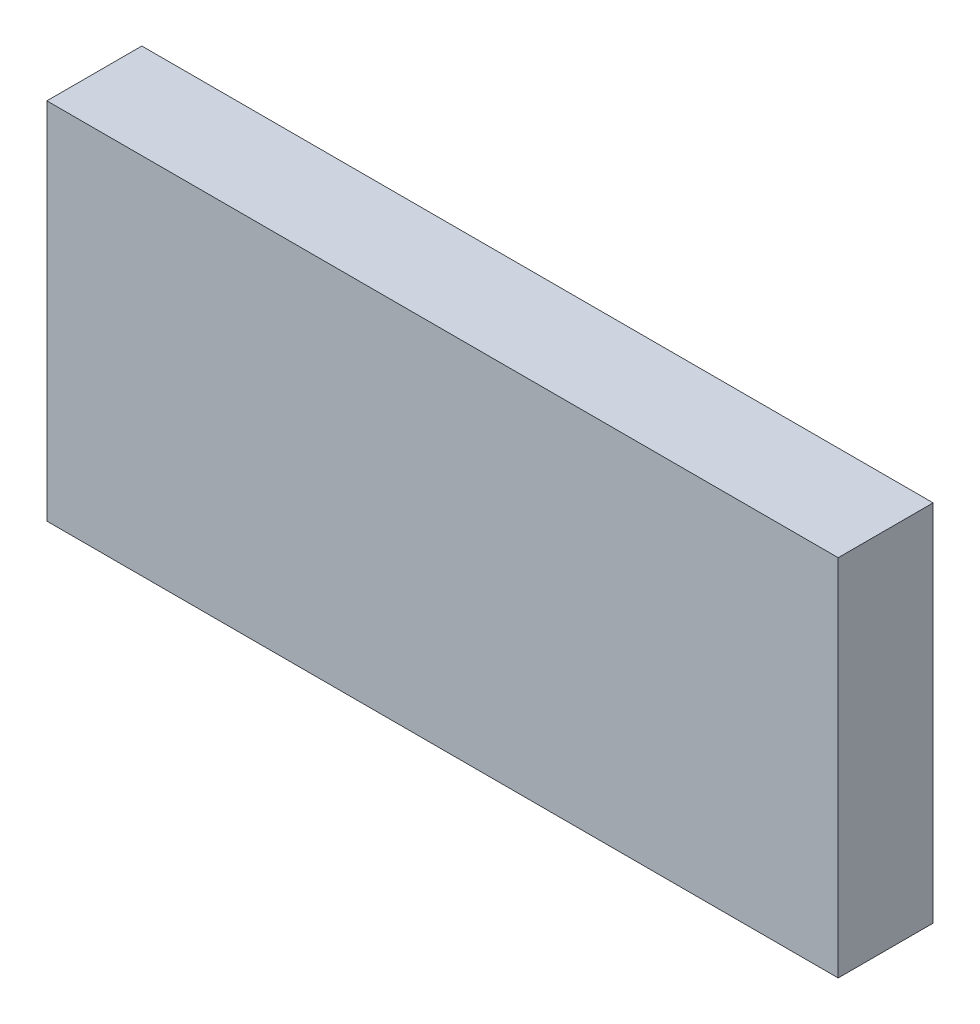
ISO-10303-21;
HEADER;
FILE_DESCRIPTION(('STEP AP214'),'2;1');
FILE_NAME('part.step','',(''),(''),'','','');
FILE_SCHEMA(('AUTOMOTIVE_DESIGN { 1 0 10303 214 1 1 1 1 }'));
ENDSEC;
DATA;
#1=APPLICATION_CONTEXT('core data for automotive mechanical design processes');
#2=APPLICATION_PROTOCOL_DEFINITION('international standard','automotive_design',2000,#1);
#3=PRODUCT_CONTEXT('',#1,'mechanical');
#4=PRODUCT('Part','Part','',(#3));
#5=PRODUCT_RELATED_PRODUCT_CATEGORY('part','',(#4));
#6=PRODUCT_DEFINITION_FORMATION('','',#4);
#7=PRODUCT_DEFINITION_CONTEXT('part definition',#1,'design');
#8=PRODUCT_DEFINITION('design','',#6,#7);
#9=PRODUCT_DEFINITION_SHAPE('','',#8);
#10=(LENGTH_UNIT() NAMED_UNIT(*) SI_UNIT(.MILLI.,.METRE.));
#11=(NAMED_UNIT(*) PLANE_ANGLE_UNIT() SI_UNIT($,.RADIAN.));
#12=(NAMED_UNIT(*) SI_UNIT($,.STERADIAN.) SOLID_ANGLE_UNIT());
#13=UNCERTAINTY_MEASURE_WITH_UNIT(LENGTH_MEASURE(1.E-05),#10,'distance_accuracy_value','');
#14=(GEOMETRIC_REPRESENTATION_CONTEXT(3) GLOBAL_UNCERTAINTY_ASSIGNED_CONTEXT((#13)) GLOBAL_UNIT_ASSIGNED_CONTEXT((#10,
#11,#12)) REPRESENTATION_CONTEXT('',''));
#15=CARTESIAN_POINT('',(0.,0.,0.));
#16=DIRECTION('',(0.,0.,1.));
#17=DIRECTION('',(1.,0.,0.));
#18=AXIS2_PLACEMENT_3D('',#15,#16,#17);
#19=CARTESIAN_POINT('',(0.,0.,6.));
#20=DIRECTION('',(-1.,0.,0.));
#21=DIRECTION('',(0.,-1.,0.));
#22=AXIS2_PLACEMENT_3D('',#19,#20,#21);
#23=PLANE('',#22);
#24=DIRECTION('',(0.,1.,0.));
#25=VECTOR('',#24,1.);
#26=CARTESIAN_POINT('',(0.,0.,0.));
#27=LINE('',#26,#25);
#28=CARTESIAN_POINT('',(0.,0.,0.));
#29=VERTEX_POINT('',#28);
#30=CARTESIAN_POINT('',(0.,23.,0.));
#31=VERTEX_POINT('',#30);
#32=EDGE_CURVE('E96',#29,#31,#27,.T.);
#33=ORIENTED_EDGE('',*,*,#32,.T.);
#34=DIRECTION('',(0.,0.,-1.));
#35=VECTOR('',#34,1.);
#36=CARTESIAN_POINT('',(0.,23.,6.));
#37=LINE('',#36,#35);
#38=CARTESIAN_POINT('',(0.,23.,6.));
#39=VERTEX_POINT('',#38);
#40=EDGE_CURVE('E11',#39,#31,#37,.T.);
#41=ORIENTED_EDGE('',*,*,#40,.F.);
#42=DIRECTION('',(0.,1.,0.));
#43=VECTOR('',#42,1.);
#44=CARTESIAN_POINT('',(0.,0.,6.));
#45=LINE('',#44,#43);
#46=CARTESIAN_POINT('',(0.,0.,6.));
#47=VERTEX_POINT('',#46);
#48=EDGE_CURVE('E84',#47,#39,#45,.T.);
#49=ORIENTED_EDGE('',*,*,#48,.F.);
#50=DIRECTION('',(0.,0.,-1.));
#51=VECTOR('',#50,1.);
#52=CARTESIAN_POINT('',(0.,0.,6.));
#53=LINE('',#52,#51);
#54=EDGE_CURVE('E92',#47,#29,#53,.T.);
#55=ORIENTED_EDGE('',*,*,#54,.T.);
#56=EDGE_LOOP('',(#33,#41,#49,#55));
#57=FACE_BOUND('',#56,.T.);
#58=ADVANCED_FACE('F33',(#57),#23,.F.);
#59=CARTESIAN_POINT('',(0.,23.,6.));
#60=DIRECTION('',(0.,-1.,0.));
#61=DIRECTION('',(1.,0.,0.));
#62=AXIS2_PLACEMENT_3D('',#59,#60,#61);
#63=PLANE('',#62);
#64=DIRECTION('',(-1.,0.,0.));
#65=VECTOR('',#64,1.);
#66=CARTESIAN_POINT('',(0.,23.,0.));
#67=LINE('',#66,#65);
#68=CARTESIAN_POINT('',(-50.,23.,0.));
#69=VERTEX_POINT('',#68);
#70=EDGE_CURVE('E88',#31,#69,#67,.T.);
#71=ORIENTED_EDGE('',*,*,#70,.T.);
#72=DIRECTION('',(0.,0.,-1.));
#73=VECTOR('',#72,1.);
#74=CARTESIAN_POINT('',(-50.,23.,6.));
#75=LINE('',#74,#73);
#76=CARTESIAN_POINT('',(-50.,23.,6.));
#77=VERTEX_POINT('',#76);
#78=EDGE_CURVE('E41',#77,#69,#75,.T.);
#79=ORIENTED_EDGE('',*,*,#78,.F.);
#80=DIRECTION('',(-1.,0.,0.));
#81=VECTOR('',#80,1.);
#82=CARTESIAN_POINT('',(0.,23.,6.));
#83=LINE('',#82,#81);
#84=EDGE_CURVE('E79',#39,#77,#83,.T.);
#85=ORIENTED_EDGE('',*,*,#84,.F.);
#86=ORIENTED_EDGE('',*,*,#40,.T.);
#87=EDGE_LOOP('',(#71,#79,#85,#86));
#88=FACE_BOUND('',#87,.T.);
#89=ADVANCED_FACE('F87',(#88),#63,.F.);
#90=CARTESIAN_POINT('',(-50.,0.,6.));
#91=DIRECTION('',(1.,0.,0.));
#92=DIRECTION('',(0.,0.,-1.));
#93=AXIS2_PLACEMENT_3D('',#90,#91,#92);
#94=PLANE('',#93);
#95=DIRECTION('',(0.,-1.,0.));
#96=VECTOR('',#95,1.);
#97=CARTESIAN_POINT('',(-50.,0.,0.));
#98=LINE('',#97,#96);
#99=CARTESIAN_POINT('',(-50.,0.,0.));
#100=VERTEX_POINT('',#99);
#101=EDGE_CURVE('E66',#69,#100,#98,.T.);
#102=ORIENTED_EDGE('',*,*,#101,.T.);
#103=DIRECTION('',(0.,0.,-1.));
#104=VECTOR('',#103,1.);
#105=CARTESIAN_POINT('',(-50.,0.,6.));
#106=LINE('',#105,#104);
#107=CARTESIAN_POINT('',(-50.,0.,6.));
#108=VERTEX_POINT('',#107);
#109=EDGE_CURVE('E89',#108,#100,#106,.T.);
#110=ORIENTED_EDGE('',*,*,#109,.F.);
#111=DIRECTION('',(0.,-1.,0.));
#112=VECTOR('',#111,1.);
#113=CARTESIAN_POINT('',(-50.,0.,6.));
#114=LINE('',#113,#112);
#115=EDGE_CURVE('E82',#77,#108,#114,.T.);
#116=ORIENTED_EDGE('',*,*,#115,.F.);
#117=ORIENTED_EDGE('',*,*,#78,.T.);
#118=EDGE_LOOP('',(#102,#110,#116,#117));
#119=FACE_BOUND('',#118,.T.);
#120=ADVANCED_FACE('F90',(#119),#94,.F.);
#121=CARTESIAN_POINT('',(0.,0.,6.));
#122=DIRECTION('',(0.,1.,0.));
#123=DIRECTION('',(-1.,0.,0.));
#124=AXIS2_PLACEMENT_3D('',#121,#122,#123);
#125=PLANE('',#124);
#126=DIRECTION('',(1.,0.,0.));
#127=VECTOR('',#126,1.);
#128=CARTESIAN_POINT('',(0.,0.,0.));
#129=LINE('',#128,#127);
#130=EDGE_CURVE('E72',#100,#29,#129,.T.);
#131=ORIENTED_EDGE('',*,*,#130,.T.);
#132=ORIENTED_EDGE('',*,*,#54,.F.);
#133=DIRECTION('',(1.,0.,0.));
#134=VECTOR('',#133,1.);
#135=CARTESIAN_POINT('',(0.,0.,6.));
#136=LINE('',#135,#134);
#137=EDGE_CURVE('E49',#108,#47,#136,.T.);
#138=ORIENTED_EDGE('',*,*,#137,.F.);
#139=ORIENTED_EDGE('',*,*,#109,.T.);
#140=EDGE_LOOP('',(#131,#132,#138,#139));
#141=FACE_BOUND('',#140,.T.);
#142=ADVANCED_FACE('F103',(#141),#125,.F.);
#143=CARTESIAN_POINT('',(0.,0.,6.));
#144=DIRECTION('',(0.,0.,1.));
#145=DIRECTION('',(1.,0.,0.));
#146=AXIS2_PLACEMENT_3D('',#143,#144,#145);
#147=PLANE('',#146);
#148=ORIENTED_EDGE('',*,*,#48,.T.);
#149=ORIENTED_EDGE('',*,*,#84,.T.);
#150=ORIENTED_EDGE('',*,*,#115,.T.);
#151=ORIENTED_EDGE('',*,*,#137,.T.);
#152=EDGE_LOOP('',(#148,#149,#150,#151));
#153=FACE_BOUND('',#152,.T.);
#154=ADVANCED_FACE('F80',(#153),#147,.T.);
#155=CARTESIAN_POINT('',(0.,0.,0.));
#156=DIRECTION('',(0.,0.,1.));
#157=DIRECTION('',(1.,0.,0.));
#158=AXIS2_PLACEMENT_3D('',#155,#156,#157);
#159=PLANE('',#158);
#160=ORIENTED_EDGE('',*,*,#32,.F.);
#161=ORIENTED_EDGE('',*,*,#130,.F.);
#162=ORIENTED_EDGE('',*,*,#101,.F.);
#163=ORIENTED_EDGE('',*,*,#70,.F.);
#164=EDGE_LOOP('',(#160,#161,#162,#163));
#165=FACE_BOUND('',#164,.T.);
#166=ADVANCED_FACE('F106',(#165),#159,.F.);
#167=CLOSED_SHELL('',(#58,#89,#120,#142,#154,#166));
#168=MANIFOLD_SOLID_BREP('B2',#167);
#169=ADVANCED_BREP_SHAPE_REPRESENTATION('',(#18,#168),#14);
#170=SHAPE_DEFINITION_REPRESENTATION(#9,#169);
ENDSEC;
END-ISO-10303-21;
